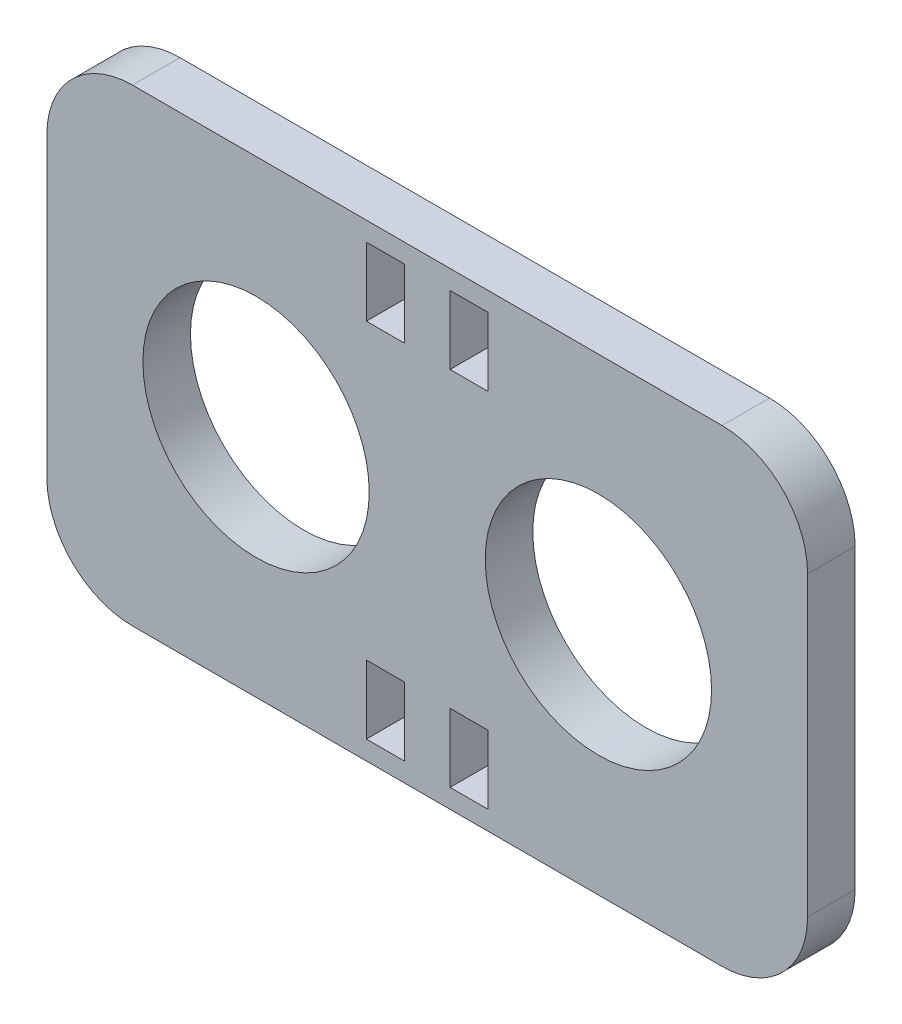
ISO-10303-21;
HEADER;
FILE_DESCRIPTION(('STEP AP214'),'2;1');
FILE_NAME('part.step','',(''),(''),'','','');
FILE_SCHEMA(('AUTOMOTIVE_DESIGN { 1 0 10303 214 1 1 1 1 }'));
ENDSEC;
DATA;
#1=APPLICATION_CONTEXT('core data for automotive mechanical design processes');
#2=APPLICATION_PROTOCOL_DEFINITION('international standard','automotive_design',2000,#1);
#3=PRODUCT_CONTEXT('',#1,'mechanical');
#4=PRODUCT('Part','Part','',(#3));
#5=PRODUCT_RELATED_PRODUCT_CATEGORY('part','',(#4));
#6=PRODUCT_DEFINITION_FORMATION('','',#4);
#7=PRODUCT_DEFINITION_CONTEXT('part definition',#1,'design');
#8=PRODUCT_DEFINITION('design','',#6,#7);
#9=PRODUCT_DEFINITION_SHAPE('','',#8);
#10=(LENGTH_UNIT() NAMED_UNIT(*) SI_UNIT(.MILLI.,.METRE.));
#11=(NAMED_UNIT(*) PLANE_ANGLE_UNIT() SI_UNIT($,.RADIAN.));
#12=(NAMED_UNIT(*) SI_UNIT($,.STERADIAN.) SOLID_ANGLE_UNIT());
#13=UNCERTAINTY_MEASURE_WITH_UNIT(LENGTH_MEASURE(1.E-05),#10,'distance_accuracy_value','');
#14=(GEOMETRIC_REPRESENTATION_CONTEXT(3) GLOBAL_UNCERTAINTY_ASSIGNED_CONTEXT((#13)) GLOBAL_UNIT_ASSIGNED_CONTEXT((#10,
#11,#12)) REPRESENTATION_CONTEXT('',''));
#15=CARTESIAN_POINT('',(0.,0.,0.));
#16=DIRECTION('',(0.,0.,1.));
#17=DIRECTION('',(1.,0.,0.));
#18=AXIS2_PLACEMENT_3D('',#15,#16,#17);
#19=CARTESIAN_POINT('',(-8.25500000000001,9.92499231180402,3.175));
#20=DIRECTION('',(0.,0.,1.));
#21=DIRECTION('',(1.,0.,0.));
#22=AXIS2_PLACEMENT_3D('',#19,#20,#21);
#23=PLANE('',#22);
#24=CARTESIAN_POINT('',(0.,0.,3.175));
#25=DIRECTION('',(0.,0.,1.));
#26=DIRECTION('',(1.,0.,0.));
#27=AXIS2_PLACEMENT_3D('',#24,#25,#26);
#28=CIRCLE('',#27,7.5565);
#29=CARTESIAN_POINT('',(7.5565,0.,3.175));
#30=VERTEX_POINT('',#29);
#31=EDGE_CURVE('E424',#30,#30,#28,.T.);
#32=ORIENTED_EDGE('',*,*,#31,.F.);
#33=EDGE_LOOP('',(#32));
#34=FACE_BOUND('',#33,.T.);
#35=DIRECTION('',(0.,1.,0.));
#36=VECTOR('',#35,1.);
#37=CARTESIAN_POINT('',(12.954,-14.369992311804,3.175));
#38=LINE('',#37,#36);
#39=CARTESIAN_POINT('',(12.954,-14.369992311804,3.175));
#40=VERTEX_POINT('',#39);
#41=CARTESIAN_POINT('',(12.954,-9.79799231180403,3.175));
#42=VERTEX_POINT('',#41);
#43=EDGE_CURVE('E435',#40,#42,#38,.T.);
#44=ORIENTED_EDGE('',*,*,#43,.T.);
#45=DIRECTION('',(1.,0.,0.));
#46=VECTOR('',#45,1.);
#47=CARTESIAN_POINT('',(12.954,-9.79799231180403,3.175));
#48=LINE('',#47,#46);
#49=CARTESIAN_POINT('',(15.494,-9.79799231180403,3.175));
#50=VERTEX_POINT('',#49);
#51=EDGE_CURVE('E438',#42,#50,#48,.T.);
#52=ORIENTED_EDGE('',*,*,#51,.T.);
#53=DIRECTION('',(0.,1.,0.));
#54=VECTOR('',#53,1.);
#55=CARTESIAN_POINT('',(15.494,-14.369992311804,3.175));
#56=LINE('',#55,#54);
#57=CARTESIAN_POINT('',(15.494,-14.369992311804,3.175));
#58=VERTEX_POINT('',#57);
#59=EDGE_CURVE('E442',#58,#50,#56,.T.);
#60=ORIENTED_EDGE('',*,*,#59,.F.);
#61=DIRECTION('',(1.,0.,0.));
#62=VECTOR('',#61,1.);
#63=CARTESIAN_POINT('',(12.954,-14.369992311804,3.175));
#64=LINE('',#63,#62);
#65=EDGE_CURVE('E445',#40,#58,#64,.T.);
#66=ORIENTED_EDGE('',*,*,#65,.F.);
#67=EDGE_LOOP('',(#44,#52,#60,#66));
#68=FACE_BOUND('',#67,.T.);
#69=CARTESIAN_POINT('',(-8.25500000000001,9.92499231180402,3.175));
#70=DIRECTION('',(0.,0.,1.));
#71=DIRECTION('',(1.,0.,0.));
#72=AXIS2_PLACEMENT_3D('',#69,#70,#71);
#73=CIRCLE('',#72,5.715);
#74=CARTESIAN_POINT('',(-8.25499999999997,15.639992311804,3.175));
#75=VERTEX_POINT('',#74);
#76=CARTESIAN_POINT('',(-13.97,9.92499231180402,3.175));
#77=VERTEX_POINT('',#76);
#78=EDGE_CURVE('E530',#75,#77,#73,.T.);
#79=ORIENTED_EDGE('',*,*,#78,.T.);
#80=DIRECTION('',(0.,-1.,0.));
#81=VECTOR('',#80,1.);
#82=CARTESIAN_POINT('',(-13.97,9.92499231180402,3.175));
#83=LINE('',#82,#81);
#84=CARTESIAN_POINT('',(-13.97,-9.92499231180395,3.175));
#85=VERTEX_POINT('',#84);
#86=EDGE_CURVE('E533',#77,#85,#83,.T.);
#87=ORIENTED_EDGE('',*,*,#86,.T.);
#88=CARTESIAN_POINT('',(-8.255,-9.92499231180403,3.175));
#89=DIRECTION('',(0.,0.,1.));
#90=DIRECTION('',(1.,0.,0.));
#91=AXIS2_PLACEMENT_3D('',#88,#89,#90);
#92=CIRCLE('',#91,5.715);
#93=CARTESIAN_POINT('',(-8.25499999999997,-15.639992311804,3.175));
#94=VERTEX_POINT('',#93);
#95=EDGE_CURVE('E536',#85,#94,#92,.T.);
#96=ORIENTED_EDGE('',*,*,#95,.T.);
#97=DIRECTION('',(1.,0.,0.));
#98=VECTOR('',#97,1.);
#99=CARTESIAN_POINT('',(-8.25499999999997,-15.639992311804,3.175));
#100=LINE('',#99,#98);
#101=CARTESIAN_POINT('',(31.115,-15.639992311804,3.175));
#102=VERTEX_POINT('',#101);
#103=EDGE_CURVE('E538',#94,#102,#100,.T.);
#104=ORIENTED_EDGE('',*,*,#103,.T.);
#105=CARTESIAN_POINT('',(31.115,-9.92499231180402,3.175));
#106=DIRECTION('',(0.,0.,-1.));
#107=DIRECTION('',(-1.,0.,0.));
#108=AXIS2_PLACEMENT_3D('',#105,#106,#107);
#109=CIRCLE('',#108,5.715);
#110=CARTESIAN_POINT('',(36.83,-9.92499231180402,3.175));
#111=VERTEX_POINT('',#110);
#112=EDGE_CURVE('E540',#111,#102,#109,.T.);
#113=ORIENTED_EDGE('',*,*,#112,.F.);
#114=DIRECTION('',(0.,-1.,0.));
#115=VECTOR('',#114,1.);
#116=CARTESIAN_POINT('',(36.83,9.92499231180402,3.175));
#117=LINE('',#116,#115);
#118=CARTESIAN_POINT('',(36.83,9.92499231180402,3.175));
#119=VERTEX_POINT('',#118);
#120=EDGE_CURVE('E543',#119,#111,#117,.T.);
#121=ORIENTED_EDGE('',*,*,#120,.F.);
#122=CARTESIAN_POINT('',(31.115,9.92499231180402,3.175));
#123=DIRECTION('',(0.,0.,1.));
#124=DIRECTION('',(1.,0.,0.));
#125=AXIS2_PLACEMENT_3D('',#122,#123,#124);
#126=CIRCLE('',#125,5.715);
#127=CARTESIAN_POINT('',(31.115,15.639992311804,3.175));
#128=VERTEX_POINT('',#127);
#129=EDGE_CURVE('E546',#119,#128,#126,.T.);
#130=ORIENTED_EDGE('',*,*,#129,.T.);
#131=DIRECTION('',(1.,0.,0.));
#132=VECTOR('',#131,1.);
#133=CARTESIAN_POINT('',(-8.25499999999997,15.639992311804,3.175));
#134=LINE('',#133,#132);
#135=EDGE_CURVE('E548',#75,#128,#134,.T.);
#136=ORIENTED_EDGE('',*,*,#135,.F.);
#137=EDGE_LOOP('',(#79,#87,#96,#104,#113,#121,#130,#136));
#138=FACE_BOUND('',#137,.T.);
#139=DIRECTION('',(0.,-1.,0.));
#140=VECTOR('',#139,1.);
#141=CARTESIAN_POINT('',(7.36599999999999,14.369992311804,3.175));
#142=LINE('',#141,#140);
#143=CARTESIAN_POINT('',(7.36599999999999,14.369992311804,3.175));
#144=VERTEX_POINT('',#143);
#145=CARTESIAN_POINT('',(7.36599999999999,9.79799231180402,3.175));
#146=VERTEX_POINT('',#145);
#147=EDGE_CURVE('E500',#144,#146,#142,.T.);
#148=ORIENTED_EDGE('',*,*,#147,.F.);
#149=DIRECTION('',(-1.,0.,0.));
#150=VECTOR('',#149,1.);
#151=CARTESIAN_POINT('',(9.90599999999999,14.369992311804,3.175));
#152=LINE('',#151,#150);
#153=CARTESIAN_POINT('',(9.90599999999999,14.369992311804,3.175));
#154=VERTEX_POINT('',#153);
#155=EDGE_CURVE('E498',#154,#144,#152,.T.);
#156=ORIENTED_EDGE('',*,*,#155,.F.);
#157=DIRECTION('',(0.,-1.,0.));
#158=VECTOR('',#157,1.);
#159=CARTESIAN_POINT('',(9.90599999999999,14.369992311804,3.175));
#160=LINE('',#159,#158);
#161=CARTESIAN_POINT('',(9.90599999999999,9.79799231180402,3.175));
#162=VERTEX_POINT('',#161);
#163=EDGE_CURVE('E506',#154,#162,#160,.T.);
#164=ORIENTED_EDGE('',*,*,#163,.T.);
#165=DIRECTION('',(-1.,0.,0.));
#166=VECTOR('',#165,1.);
#167=CARTESIAN_POINT('',(9.90599999999999,9.79799231180402,3.175));
#168=LINE('',#167,#166);
#169=EDGE_CURVE('E503',#162,#146,#168,.T.);
#170=ORIENTED_EDGE('',*,*,#169,.T.);
#171=EDGE_LOOP('',(#148,#156,#164,#170));
#172=FACE_BOUND('',#171,.T.);
#173=DIRECTION('',(1.,0.,0.));
#174=VECTOR('',#173,1.);
#175=CARTESIAN_POINT('',(12.954,9.79799231180402,3.175));
#176=LINE('',#175,#174);
#177=CARTESIAN_POINT('',(12.954,9.79799231180402,3.175));
#178=VERTEX_POINT('',#177);
#179=CARTESIAN_POINT('',(15.494,9.79799231180402,3.175));
#180=VERTEX_POINT('',#179);
#181=EDGE_CURVE('E468',#178,#180,#176,.T.);
#182=ORIENTED_EDGE('',*,*,#181,.F.);
#183=DIRECTION('',(0.,-1.,0.));
#184=VECTOR('',#183,1.);
#185=CARTESIAN_POINT('',(12.954,14.369992311804,3.175));
#186=LINE('',#185,#184);
#187=CARTESIAN_POINT('',(12.954,14.369992311804,3.175));
#188=VERTEX_POINT('',#187);
#189=EDGE_CURVE('E466',#188,#178,#186,.T.);
#190=ORIENTED_EDGE('',*,*,#189,.F.);
#191=DIRECTION('',(1.,0.,0.));
#192=VECTOR('',#191,1.);
#193=CARTESIAN_POINT('',(12.954,14.369992311804,3.175));
#194=LINE('',#193,#192);
#195=CARTESIAN_POINT('',(15.494,14.369992311804,3.175));
#196=VERTEX_POINT('',#195);
#197=EDGE_CURVE('E474',#188,#196,#194,.T.);
#198=ORIENTED_EDGE('',*,*,#197,.T.);
#199=DIRECTION('',(0.,-1.,0.));
#200=VECTOR('',#199,1.);
#201=CARTESIAN_POINT('',(15.494,14.369992311804,3.175));
#202=LINE('',#201,#200);
#203=EDGE_CURVE('E471',#196,#180,#202,.T.);
#204=ORIENTED_EDGE('',*,*,#203,.T.);
#205=EDGE_LOOP('',(#182,#190,#198,#204));
#206=FACE_BOUND('',#205,.T.);
#207=DIRECTION('',(-1.,0.,0.));
#208=VECTOR('',#207,1.);
#209=CARTESIAN_POINT('',(9.90599999999998,-9.79799231180403,3.175));
#210=LINE('',#209,#208);
#211=CARTESIAN_POINT('',(9.90599999999998,-9.79799231180403,3.175));
#212=VERTEX_POINT('',#211);
#213=CARTESIAN_POINT('',(7.36599999999999,-9.79799231180403,3.175));
#214=VERTEX_POINT('',#213);
#215=EDGE_CURVE('E406',#212,#214,#210,.T.);
#216=ORIENTED_EDGE('',*,*,#215,.F.);
#217=DIRECTION('',(0.,1.,0.));
#218=VECTOR('',#217,1.);
#219=CARTESIAN_POINT('',(9.90599999999998,-14.369992311804,3.175));
#220=LINE('',#219,#218);
#221=CARTESIAN_POINT('',(9.90599999999998,-14.369992311804,3.175));
#222=VERTEX_POINT('',#221);
#223=EDGE_CURVE('E397',#222,#212,#220,.T.);
#224=ORIENTED_EDGE('',*,*,#223,.F.);
#225=DIRECTION('',(-1.,0.,0.));
#226=VECTOR('',#225,1.);
#227=CARTESIAN_POINT('',(9.90599999999998,-14.369992311804,3.175));
#228=LINE('',#227,#226);
#229=CARTESIAN_POINT('',(7.36599999999999,-14.369992311804,3.175));
#230=VERTEX_POINT('',#229);
#231=EDGE_CURVE('E418',#222,#230,#228,.T.);
#232=ORIENTED_EDGE('',*,*,#231,.T.);
#233=DIRECTION('',(0.,1.,0.));
#234=VECTOR('',#233,1.);
#235=CARTESIAN_POINT('',(7.36599999999999,-14.369992311804,3.175));
#236=LINE('',#235,#234);
#237=EDGE_CURVE('E251',#230,#214,#236,.T.);
#238=ORIENTED_EDGE('',*,*,#237,.T.);
#239=EDGE_LOOP('',(#216,#224,#232,#238));
#240=FACE_BOUND('',#239,.T.);
#241=CARTESIAN_POINT('',(22.86,0.,3.175));
#242=DIRECTION('',(0.,0.,1.));
#243=DIRECTION('',(1.,0.,0.));
#244=AXIS2_PLACEMENT_3D('',#241,#242,#243);
#245=CIRCLE('',#244,7.5565);
#246=CARTESIAN_POINT('',(30.4165,0.,3.175));
#247=VERTEX_POINT('',#246);
#248=EDGE_CURVE('E883',#247,#247,#245,.T.);
#249=ORIENTED_EDGE('',*,*,#248,.F.);
#250=EDGE_LOOP('',(#249));
#251=FACE_BOUND('',#250,.T.);
#252=ADVANCED_FACE('F236',(#34,#68,#138,#172,#206,#240,#251),#23,.T.);
#253=CARTESIAN_POINT('',(-8.25500000000001,9.92499231180402,0.));
#254=DIRECTION('',(0.,0.,1.));
#255=DIRECTION('',(1.,0.,0.));
#256=AXIS2_PLACEMENT_3D('',#253,#254,#255);
#257=PLANE('',#256);
#258=DIRECTION('',(0.,-1.,0.));
#259=VECTOR('',#258,1.);
#260=CARTESIAN_POINT('',(12.954,14.369992311804,0.));
#261=LINE('',#260,#259);
#262=CARTESIAN_POINT('',(12.954,14.369992311804,0.));
#263=VERTEX_POINT('',#262);
#264=CARTESIAN_POINT('',(12.954,9.79799231180402,0.));
#265=VERTEX_POINT('',#264);
#266=EDGE_CURVE('E459',#263,#265,#261,.T.);
#267=ORIENTED_EDGE('',*,*,#266,.T.);
#268=DIRECTION('',(1.,0.,0.));
#269=VECTOR('',#268,1.);
#270=CARTESIAN_POINT('',(12.954,9.79799231180402,0.));
#271=LINE('',#270,#269);
#272=CARTESIAN_POINT('',(15.494,9.79799231180402,0.));
#273=VERTEX_POINT('',#272);
#274=EDGE_CURVE('E480',#265,#273,#271,.T.);
#275=ORIENTED_EDGE('',*,*,#274,.T.);
#276=DIRECTION('',(0.,-1.,0.));
#277=VECTOR('',#276,1.);
#278=CARTESIAN_POINT('',(15.494,14.369992311804,0.));
#279=LINE('',#278,#277);
#280=CARTESIAN_POINT('',(15.494,14.369992311804,0.));
#281=VERTEX_POINT('',#280);
#282=EDGE_CURVE('E483',#281,#273,#279,.T.);
#283=ORIENTED_EDGE('',*,*,#282,.F.);
#284=DIRECTION('',(1.,0.,0.));
#285=VECTOR('',#284,1.);
#286=CARTESIAN_POINT('',(12.954,14.369992311804,0.));
#287=LINE('',#286,#285);
#288=EDGE_CURVE('E469',#263,#281,#287,.T.);
#289=ORIENTED_EDGE('',*,*,#288,.F.);
#290=EDGE_LOOP('',(#267,#275,#283,#289));
#291=FACE_BOUND('',#290,.T.);
#292=CARTESIAN_POINT('',(-8.25500000000001,9.92499231180402,0.));
#293=DIRECTION('',(0.,0.,1.));
#294=DIRECTION('',(1.,0.,0.));
#295=AXIS2_PLACEMENT_3D('',#292,#293,#294);
#296=CIRCLE('',#295,5.715);
#297=CARTESIAN_POINT('',(-8.25499999999997,15.639992311804,0.));
#298=VERTEX_POINT('',#297);
#299=CARTESIAN_POINT('',(-13.97,9.92499231180402,0.));
#300=VERTEX_POINT('',#299);
#301=EDGE_CURVE('E529',#298,#300,#296,.T.);
#302=ORIENTED_EDGE('',*,*,#301,.F.);
#303=DIRECTION('',(1.,0.,0.));
#304=VECTOR('',#303,1.);
#305=CARTESIAN_POINT('',(-8.25499999999997,15.639992311804,0.));
#306=LINE('',#305,#304);
#307=CARTESIAN_POINT('',(31.115,15.639992311804,0.));
#308=VERTEX_POINT('',#307);
#309=EDGE_CURVE('E534',#298,#308,#306,.T.);
#310=ORIENTED_EDGE('',*,*,#309,.T.);
#311=CARTESIAN_POINT('',(31.115,9.92499231180402,0.));
#312=DIRECTION('',(0.,0.,1.));
#313=DIRECTION('',(1.,0.,0.));
#314=AXIS2_PLACEMENT_3D('',#311,#312,#313);
#315=CIRCLE('',#314,5.715);
#316=CARTESIAN_POINT('',(36.83,9.92499231180402,0.));
#317=VERTEX_POINT('',#316);
#318=EDGE_CURVE('E567',#317,#308,#315,.T.);
#319=ORIENTED_EDGE('',*,*,#318,.F.);
#320=DIRECTION('',(0.,-1.,0.));
#321=VECTOR('',#320,1.);
#322=CARTESIAN_POINT('',(36.83,9.92499231180402,0.));
#323=LINE('',#322,#321);
#324=CARTESIAN_POINT('',(36.83,-9.92499231180402,0.));
#325=VERTEX_POINT('',#324);
#326=EDGE_CURVE('E564',#317,#325,#323,.T.);
#327=ORIENTED_EDGE('',*,*,#326,.T.);
#328=CARTESIAN_POINT('',(31.115,-9.92499231180402,0.));
#329=DIRECTION('',(0.,0.,-1.));
#330=DIRECTION('',(-1.,0.,0.));
#331=AXIS2_PLACEMENT_3D('',#328,#329,#330);
#332=CIRCLE('',#331,5.715);
#333=CARTESIAN_POINT('',(31.115,-15.639992311804,0.));
#334=VERTEX_POINT('',#333);
#335=EDGE_CURVE('E561',#325,#334,#332,.T.);
#336=ORIENTED_EDGE('',*,*,#335,.T.);
#337=DIRECTION('',(1.,0.,0.));
#338=VECTOR('',#337,1.);
#339=CARTESIAN_POINT('',(-8.25499999999997,-15.639992311804,0.));
#340=LINE('',#339,#338);
#341=CARTESIAN_POINT('',(-8.25499999999997,-15.639992311804,0.));
#342=VERTEX_POINT('',#341);
#343=EDGE_CURVE('E558',#342,#334,#340,.T.);
#344=ORIENTED_EDGE('',*,*,#343,.F.);
#345=CARTESIAN_POINT('',(-8.255,-9.92499231180403,0.));
#346=DIRECTION('',(0.,0.,1.));
#347=DIRECTION('',(1.,0.,0.));
#348=AXIS2_PLACEMENT_3D('',#345,#346,#347);
#349=CIRCLE('',#348,5.715);
#350=CARTESIAN_POINT('',(-13.97,-9.92499231180395,0.));
#351=VERTEX_POINT('',#350);
#352=EDGE_CURVE('E556',#351,#342,#349,.T.);
#353=ORIENTED_EDGE('',*,*,#352,.F.);
#354=DIRECTION('',(0.,-1.,0.));
#355=VECTOR('',#354,1.);
#356=CARTESIAN_POINT('',(-13.97,9.92499231180402,0.));
#357=LINE('',#356,#355);
#358=EDGE_CURVE('E554',#300,#351,#357,.T.);
#359=ORIENTED_EDGE('',*,*,#358,.F.);
#360=EDGE_LOOP('',(#302,#310,#319,#327,#336,#344,#353,#359));
#361=FACE_BOUND('',#360,.T.);
#362=DIRECTION('',(-1.,0.,0.));
#363=VECTOR('',#362,1.);
#364=CARTESIAN_POINT('',(9.90599999999999,14.369992311804,0.));
#365=LINE('',#364,#363);
#366=CARTESIAN_POINT('',(9.90599999999999,14.369992311804,0.));
#367=VERTEX_POINT('',#366);
#368=CARTESIAN_POINT('',(7.36599999999999,14.369992311804,0.));
#369=VERTEX_POINT('',#368);
#370=EDGE_CURVE('E497',#367,#369,#365,.T.);
#371=ORIENTED_EDGE('',*,*,#370,.T.);
#372=DIRECTION('',(0.,-1.,0.));
#373=VECTOR('',#372,1.);
#374=CARTESIAN_POINT('',(7.36599999999999,14.369992311804,0.));
#375=LINE('',#374,#373);
#376=CARTESIAN_POINT('',(7.36599999999999,9.79799231180402,0.));
#377=VERTEX_POINT('',#376);
#378=EDGE_CURVE('E512',#369,#377,#375,.T.);
#379=ORIENTED_EDGE('',*,*,#378,.T.);
#380=DIRECTION('',(-1.,0.,0.));
#381=VECTOR('',#380,1.);
#382=CARTESIAN_POINT('',(9.90599999999999,9.79799231180402,0.));
#383=LINE('',#382,#381);
#384=CARTESIAN_POINT('',(9.90599999999999,9.79799231180402,0.));
#385=VERTEX_POINT('',#384);
#386=EDGE_CURVE('E515',#385,#377,#383,.T.);
#387=ORIENTED_EDGE('',*,*,#386,.F.);
#388=DIRECTION('',(0.,-1.,0.));
#389=VECTOR('',#388,1.);
#390=CARTESIAN_POINT('',(9.90599999999999,14.369992311804,0.));
#391=LINE('',#390,#389);
#392=EDGE_CURVE('E501',#367,#385,#391,.T.);
#393=ORIENTED_EDGE('',*,*,#392,.F.);
#394=EDGE_LOOP('',(#371,#379,#387,#393));
#395=FACE_BOUND('',#394,.T.);
#396=DIRECTION('',(1.,0.,0.));
#397=VECTOR('',#396,1.);
#398=CARTESIAN_POINT('',(12.954,-9.79799231180403,0.));
#399=LINE('',#398,#397);
#400=CARTESIAN_POINT('',(12.954,-9.79799231180403,0.));
#401=VERTEX_POINT('',#400);
#402=CARTESIAN_POINT('',(15.494,-9.79799231180403,0.));
#403=VERTEX_POINT('',#402);
#404=EDGE_CURVE('E449',#401,#403,#399,.T.);
#405=ORIENTED_EDGE('',*,*,#404,.F.);
#406=DIRECTION('',(0.,1.,0.));
#407=VECTOR('',#406,1.);
#408=CARTESIAN_POINT('',(12.954,-14.369992311804,0.));
#409=LINE('',#408,#407);
#410=CARTESIAN_POINT('',(12.954,-14.369992311804,0.));
#411=VERTEX_POINT('',#410);
#412=EDGE_CURVE('E413',#411,#401,#409,.T.);
#413=ORIENTED_EDGE('',*,*,#412,.F.);
#414=DIRECTION('',(1.,0.,0.));
#415=VECTOR('',#414,1.);
#416=CARTESIAN_POINT('',(12.954,-14.369992311804,0.));
#417=LINE('',#416,#415);
#418=CARTESIAN_POINT('',(15.494,-14.369992311804,0.));
#419=VERTEX_POINT('',#418);
#420=EDGE_CURVE('E439',#411,#419,#417,.T.);
#421=ORIENTED_EDGE('',*,*,#420,.T.);
#422=DIRECTION('',(0.,1.,0.));
#423=VECTOR('',#422,1.);
#424=CARTESIAN_POINT('',(15.494,-14.369992311804,0.));
#425=LINE('',#424,#423);
#426=EDGE_CURVE('E452',#419,#403,#425,.T.);
#427=ORIENTED_EDGE('',*,*,#426,.T.);
#428=EDGE_LOOP('',(#405,#413,#421,#427));
#429=FACE_BOUND('',#428,.T.);
#430=DIRECTION('',(0.,1.,0.));
#431=VECTOR('',#430,1.);
#432=CARTESIAN_POINT('',(9.90599999999998,-14.369992311804,0.));
#433=LINE('',#432,#431);
#434=CARTESIAN_POINT('',(9.90599999999998,-14.369992311804,0.));
#435=VERTEX_POINT('',#434);
#436=CARTESIAN_POINT('',(9.90599999999998,-9.79799231180403,0.));
#437=VERTEX_POINT('',#436);
#438=EDGE_CURVE('E259',#435,#437,#433,.T.);
#439=ORIENTED_EDGE('',*,*,#438,.T.);
#440=DIRECTION('',(-1.,0.,0.));
#441=VECTOR('',#440,1.);
#442=CARTESIAN_POINT('',(9.90599999999998,-9.79799231180403,0.));
#443=LINE('',#442,#441);
#444=CARTESIAN_POINT('',(7.36599999999999,-9.79799231180403,0.));
#445=VERTEX_POINT('',#444);
#446=EDGE_CURVE('E412',#437,#445,#443,.T.);
#447=ORIENTED_EDGE('',*,*,#446,.T.);
#448=DIRECTION('',(0.,1.,0.));
#449=VECTOR('',#448,1.);
#450=CARTESIAN_POINT('',(7.36599999999999,-14.369992311804,0.));
#451=LINE('',#450,#449);
#452=CARTESIAN_POINT('',(7.36599999999999,-14.369992311804,0.));
#453=VERTEX_POINT('',#452);
#454=EDGE_CURVE('E426',#453,#445,#451,.T.);
#455=ORIENTED_EDGE('',*,*,#454,.F.);
#456=DIRECTION('',(-1.,0.,0.));
#457=VECTOR('',#456,1.);
#458=CARTESIAN_POINT('',(9.90599999999998,-14.369992311804,0.));
#459=LINE('',#458,#457);
#460=EDGE_CURVE('E407',#435,#453,#459,.T.);
#461=ORIENTED_EDGE('',*,*,#460,.F.);
#462=EDGE_LOOP('',(#439,#447,#455,#461));
#463=FACE_BOUND('',#462,.T.);
#464=CARTESIAN_POINT('',(0.,0.,0.));
#465=DIRECTION('',(0.,0.,1.));
#466=DIRECTION('',(1.,0.,0.));
#467=AXIS2_PLACEMENT_3D('',#464,#465,#466);
#468=CIRCLE('',#467,7.5565);
#469=CARTESIAN_POINT('',(7.5565,0.,0.));
#470=VERTEX_POINT('',#469);
#471=EDGE_CURVE('E889',#470,#470,#468,.T.);
#472=ORIENTED_EDGE('',*,*,#471,.T.);
#473=EDGE_LOOP('',(#472));
#474=FACE_BOUND('',#473,.T.);
#475=CARTESIAN_POINT('',(22.86,0.,0.));
#476=DIRECTION('',(0.,0.,1.));
#477=DIRECTION('',(1.,0.,0.));
#478=AXIS2_PLACEMENT_3D('',#475,#476,#477);
#479=CIRCLE('',#478,7.5565);
#480=CARTESIAN_POINT('',(30.4165,0.,0.));
#481=VERTEX_POINT('',#480);
#482=EDGE_CURVE('E886',#481,#481,#479,.T.);
#483=ORIENTED_EDGE('',*,*,#482,.T.);
#484=EDGE_LOOP('',(#483));
#485=FACE_BOUND('',#484,.T.);
#486=ADVANCED_FACE('F594',(#291,#361,#395,#429,#463,#474,#485),#257,.F.);
#487=CARTESIAN_POINT('',(-8.25500000000001,9.92499231180402,3.175));
#488=DIRECTION('',(0.,0.,-1.));
#489=DIRECTION('',(-1.,0.,0.));
#490=AXIS2_PLACEMENT_3D('',#487,#488,#489);
#491=CYLINDRICAL_SURFACE('',#490,5.715);
#492=ORIENTED_EDGE('',*,*,#301,.T.);
#493=DIRECTION('',(0.,0.,-1.));
#494=VECTOR('',#493,1.);
#495=CARTESIAN_POINT('',(-13.97,9.92499231180402,3.175));
#496=LINE('',#495,#494);
#497=EDGE_CURVE('E12',#77,#300,#496,.T.);
#498=ORIENTED_EDGE('',*,*,#497,.F.);
#499=ORIENTED_EDGE('',*,*,#78,.F.);
#500=DIRECTION('',(0.,0.,-1.));
#501=VECTOR('',#500,1.);
#502=CARTESIAN_POINT('',(-8.25499999999997,15.639992311804,3.175));
#503=LINE('',#502,#501);
#504=EDGE_CURVE('E551',#75,#298,#503,.T.);
#505=ORIENTED_EDGE('',*,*,#504,.T.);
#506=EDGE_LOOP('',(#492,#498,#499,#505));
#507=FACE_BOUND('',#506,.T.);
#508=ADVANCED_FACE('F238',(#507),#491,.T.);
#509=CARTESIAN_POINT('',(-13.97,9.92499231180402,3.175));
#510=DIRECTION('',(1.,0.,0.));
#511=DIRECTION('',(0.,1.,0.));
#512=AXIS2_PLACEMENT_3D('',#509,#510,#511);
#513=PLANE('',#512);
#514=ORIENTED_EDGE('',*,*,#358,.T.);
#515=DIRECTION('',(0.,0.,-1.));
#516=VECTOR('',#515,1.);
#517=CARTESIAN_POINT('',(-13.97,-9.92499231180395,3.175));
#518=LINE('',#517,#516);
#519=EDGE_CURVE('E244',#85,#351,#518,.T.);
#520=ORIENTED_EDGE('',*,*,#519,.F.);
#521=ORIENTED_EDGE('',*,*,#86,.F.);
#522=ORIENTED_EDGE('',*,*,#497,.T.);
#523=EDGE_LOOP('',(#514,#520,#521,#522));
#524=FACE_BOUND('',#523,.T.);
#525=ADVANCED_FACE('F608',(#524),#513,.F.);
#526=CARTESIAN_POINT('',(-8.255,-9.92499231180403,3.175));
#527=DIRECTION('',(0.,0.,-1.));
#528=DIRECTION('',(-1.,0.,0.));
#529=AXIS2_PLACEMENT_3D('',#526,#527,#528);
#530=CYLINDRICAL_SURFACE('',#529,5.715);
#531=ORIENTED_EDGE('',*,*,#352,.T.);
#532=DIRECTION('',(0.,0.,-1.));
#533=VECTOR('',#532,1.);
#534=CARTESIAN_POINT('',(-8.25499999999997,-15.639992311804,3.175));
#535=LINE('',#534,#533);
#536=EDGE_CURVE('E581',#94,#342,#535,.T.);
#537=ORIENTED_EDGE('',*,*,#536,.F.);
#538=ORIENTED_EDGE('',*,*,#95,.F.);
#539=ORIENTED_EDGE('',*,*,#519,.T.);
#540=EDGE_LOOP('',(#531,#537,#538,#539));
#541=FACE_BOUND('',#540,.T.);
#542=ADVANCED_FACE('F588',(#541),#530,.T.);
#543=CARTESIAN_POINT('',(-8.25499999999997,-15.639992311804,3.175));
#544=DIRECTION('',(0.,1.,0.));
#545=DIRECTION('',(-1.,0.,0.));
#546=AXIS2_PLACEMENT_3D('',#543,#544,#545);
#547=PLANE('',#546);
#548=ORIENTED_EDGE('',*,*,#343,.T.);
#549=DIRECTION('',(0.,0.,-1.));
#550=VECTOR('',#549,1.);
#551=CARTESIAN_POINT('',(31.115,-15.639992311804,3.175));
#552=LINE('',#551,#550);
#553=EDGE_CURVE('E579',#102,#334,#552,.T.);
#554=ORIENTED_EDGE('',*,*,#553,.F.);
#555=ORIENTED_EDGE('',*,*,#103,.F.);
#556=ORIENTED_EDGE('',*,*,#536,.T.);
#557=EDGE_LOOP('',(#548,#554,#555,#556));
#558=FACE_BOUND('',#557,.T.);
#559=ADVANCED_FACE('F599',(#558),#547,.F.);
#560=CARTESIAN_POINT('',(31.115,-9.92499231180402,3.175));
#561=DIRECTION('',(0.,0.,-1.));
#562=DIRECTION('',(-1.,0.,0.));
#563=AXIS2_PLACEMENT_3D('',#560,#561,#562);
#564=CYLINDRICAL_SURFACE('',#563,5.715);
#565=ORIENTED_EDGE('',*,*,#335,.F.);
#566=DIRECTION('',(0.,0.,-1.));
#567=VECTOR('',#566,1.);
#568=CARTESIAN_POINT('',(36.83,-9.92499231180402,3.175));
#569=LINE('',#568,#567);
#570=EDGE_CURVE('E577',#111,#325,#569,.T.);
#571=ORIENTED_EDGE('',*,*,#570,.F.);
#572=ORIENTED_EDGE('',*,*,#112,.T.);
#573=ORIENTED_EDGE('',*,*,#553,.T.);
#574=EDGE_LOOP('',(#565,#571,#572,#573));
#575=FACE_BOUND('',#574,.T.);
#576=ADVANCED_FACE('F622',(#575),#564,.T.);
#577=CARTESIAN_POINT('',(36.83,9.92499231180402,3.175));
#578=DIRECTION('',(1.,0.,0.));
#579=DIRECTION('',(0.,0.,-1.));
#580=AXIS2_PLACEMENT_3D('',#577,#578,#579);
#581=PLANE('',#580);
#582=ORIENTED_EDGE('',*,*,#326,.F.);
#583=DIRECTION('',(0.,0.,-1.));
#584=VECTOR('',#583,1.);
#585=CARTESIAN_POINT('',(36.83,9.92499231180402,3.175));
#586=LINE('',#585,#584);
#587=EDGE_CURVE('E575',#119,#317,#586,.T.);
#588=ORIENTED_EDGE('',*,*,#587,.F.);
#589=ORIENTED_EDGE('',*,*,#120,.T.);
#590=ORIENTED_EDGE('',*,*,#570,.T.);
#591=EDGE_LOOP('',(#582,#588,#589,#590));
#592=FACE_BOUND('',#591,.T.);
#593=ADVANCED_FACE('F620',(#592),#581,.T.);
#594=CARTESIAN_POINT('',(31.115,9.92499231180402,3.175));
#595=DIRECTION('',(0.,0.,-1.));
#596=DIRECTION('',(-1.,0.,0.));
#597=AXIS2_PLACEMENT_3D('',#594,#595,#596);
#598=CYLINDRICAL_SURFACE('',#597,5.715);
#599=ORIENTED_EDGE('',*,*,#318,.T.);
#600=DIRECTION('',(0.,0.,-1.));
#601=VECTOR('',#600,1.);
#602=CARTESIAN_POINT('',(31.115,15.639992311804,3.175));
#603=LINE('',#602,#601);
#604=EDGE_CURVE('E573',#128,#308,#603,.T.);
#605=ORIENTED_EDGE('',*,*,#604,.F.);
#606=ORIENTED_EDGE('',*,*,#129,.F.);
#607=ORIENTED_EDGE('',*,*,#587,.T.);
#608=EDGE_LOOP('',(#599,#605,#606,#607));
#609=FACE_BOUND('',#608,.T.);
#610=ADVANCED_FACE('F617',(#609),#598,.T.);
#611=CARTESIAN_POINT('',(-8.25499999999997,15.639992311804,3.175));
#612=DIRECTION('',(0.,1.,0.));
#613=DIRECTION('',(0.,0.,1.));
#614=AXIS2_PLACEMENT_3D('',#611,#612,#613);
#615=PLANE('',#614);
#616=ORIENTED_EDGE('',*,*,#309,.F.);
#617=ORIENTED_EDGE('',*,*,#504,.F.);
#618=ORIENTED_EDGE('',*,*,#135,.T.);
#619=ORIENTED_EDGE('',*,*,#604,.T.);
#620=EDGE_LOOP('',(#616,#617,#618,#619));
#621=FACE_BOUND('',#620,.T.);
#622=ADVANCED_FACE('F613',(#621),#615,.T.);
#623=CARTESIAN_POINT('',(9.90599999999999,14.369992311804,3.175));
#624=DIRECTION('',(0.,-1.,0.));
#625=DIRECTION('',(0.,0.,-1.));
#626=AXIS2_PLACEMENT_3D('',#623,#624,#625);
#627=PLANE('',#626);
#628=ORIENTED_EDGE('',*,*,#370,.F.);
#629=DIRECTION('',(0.,0.,-1.));
#630=VECTOR('',#629,1.);
#631=CARTESIAN_POINT('',(9.90599999999999,14.369992311804,3.175));
#632=LINE('',#631,#630);
#633=EDGE_CURVE('E509',#154,#367,#632,.T.);
#634=ORIENTED_EDGE('',*,*,#633,.F.);
#635=ORIENTED_EDGE('',*,*,#155,.T.);
#636=DIRECTION('',(0.,0.,-1.));
#637=VECTOR('',#636,1.);
#638=CARTESIAN_POINT('',(7.36599999999999,14.369992311804,3.175));
#639=LINE('',#638,#637);
#640=EDGE_CURVE('E526',#144,#369,#639,.T.);
#641=ORIENTED_EDGE('',*,*,#640,.T.);
#642=EDGE_LOOP('',(#628,#634,#635,#641));
#643=FACE_BOUND('',#642,.T.);
#644=ADVANCED_FACE('F642',(#643),#627,.T.);
#645=CARTESIAN_POINT('',(7.36599999999999,14.369992311804,3.175));
#646=DIRECTION('',(1.,0.,0.));
#647=DIRECTION('',(0.,1.,0.));
#648=AXIS2_PLACEMENT_3D('',#645,#646,#647);
#649=PLANE('',#648);
#650=ORIENTED_EDGE('',*,*,#378,.F.);
#651=ORIENTED_EDGE('',*,*,#640,.F.);
#652=ORIENTED_EDGE('',*,*,#147,.T.);
#653=DIRECTION('',(0.,0.,-1.));
#654=VECTOR('',#653,1.);
#655=CARTESIAN_POINT('',(7.36599999999999,9.79799231180402,3.175));
#656=LINE('',#655,#654);
#657=EDGE_CURVE('E524',#146,#377,#656,.T.);
#658=ORIENTED_EDGE('',*,*,#657,.T.);
#659=EDGE_LOOP('',(#650,#651,#652,#658));
#660=FACE_BOUND('',#659,.T.);
#661=ADVANCED_FACE('F662',(#660),#649,.T.);
#662=CARTESIAN_POINT('',(9.90599999999999,9.79799231180402,3.175));
#663=DIRECTION('',(0.,-1.,0.));
#664=DIRECTION('',(1.,0.,0.));
#665=AXIS2_PLACEMENT_3D('',#662,#663,#664);
#666=PLANE('',#665);
#667=ORIENTED_EDGE('',*,*,#386,.T.);
#668=ORIENTED_EDGE('',*,*,#657,.F.);
#669=ORIENTED_EDGE('',*,*,#169,.F.);
#670=DIRECTION('',(0.,0.,-1.));
#671=VECTOR('',#670,1.);
#672=CARTESIAN_POINT('',(9.90599999999999,9.79799231180402,3.175));
#673=LINE('',#672,#671);
#674=EDGE_CURVE('E522',#162,#385,#673,.T.);
#675=ORIENTED_EDGE('',*,*,#674,.T.);
#676=EDGE_LOOP('',(#667,#668,#669,#675));
#677=FACE_BOUND('',#676,.T.);
#678=ADVANCED_FACE('F669',(#677),#666,.F.);
#679=CARTESIAN_POINT('',(9.90599999999999,14.369992311804,3.175));
#680=DIRECTION('',(1.,0.,0.));
#681=DIRECTION('',(0.,1.,0.));
#682=AXIS2_PLACEMENT_3D('',#679,#680,#681);
#683=PLANE('',#682);
#684=ORIENTED_EDGE('',*,*,#392,.T.);
#685=ORIENTED_EDGE('',*,*,#674,.F.);
#686=ORIENTED_EDGE('',*,*,#163,.F.);
#687=ORIENTED_EDGE('',*,*,#633,.T.);
#688=EDGE_LOOP('',(#684,#685,#686,#687));
#689=FACE_BOUND('',#688,.T.);
#690=ADVANCED_FACE('F676',(#689),#683,.F.);
#691=CARTESIAN_POINT('',(12.954,14.369992311804,3.175));
#692=DIRECTION('',(1.,0.,0.));
#693=DIRECTION('',(0.,0.,-1.));
#694=AXIS2_PLACEMENT_3D('',#691,#692,#693);
#695=PLANE('',#694);
#696=ORIENTED_EDGE('',*,*,#266,.F.);
#697=DIRECTION('',(0.,0.,-1.));
#698=VECTOR('',#697,1.);
#699=CARTESIAN_POINT('',(12.954,14.369992311804,3.175));
#700=LINE('',#699,#698);
#701=EDGE_CURVE('E477',#188,#263,#700,.T.);
#702=ORIENTED_EDGE('',*,*,#701,.F.);
#703=ORIENTED_EDGE('',*,*,#189,.T.);
#704=DIRECTION('',(0.,0.,-1.));
#705=VECTOR('',#704,1.);
#706=CARTESIAN_POINT('',(12.954,9.79799231180402,3.175));
#707=LINE('',#706,#705);
#708=EDGE_CURVE('E494',#178,#265,#707,.T.);
#709=ORIENTED_EDGE('',*,*,#708,.T.);
#710=EDGE_LOOP('',(#696,#702,#703,#709));
#711=FACE_BOUND('',#710,.T.);
#712=ADVANCED_FACE('F684',(#711),#695,.T.);
#713=CARTESIAN_POINT('',(12.954,9.79799231180402,3.175));
#714=DIRECTION('',(0.,1.,0.));
#715=DIRECTION('',(0.,0.,1.));
#716=AXIS2_PLACEMENT_3D('',#713,#714,#715);
#717=PLANE('',#716);
#718=ORIENTED_EDGE('',*,*,#274,.F.);
#719=ORIENTED_EDGE('',*,*,#708,.F.);
#720=ORIENTED_EDGE('',*,*,#181,.T.);
#721=DIRECTION('',(0.,0.,-1.));
#722=VECTOR('',#721,1.);
#723=CARTESIAN_POINT('',(15.494,9.79799231180402,3.175));
#724=LINE('',#723,#722);
#725=EDGE_CURVE('E492',#180,#273,#724,.T.);
#726=ORIENTED_EDGE('',*,*,#725,.T.);
#727=EDGE_LOOP('',(#718,#719,#720,#726));
#728=FACE_BOUND('',#727,.T.);
#729=ADVANCED_FACE('F692',(#728),#717,.T.);
#730=CARTESIAN_POINT('',(15.494,14.369992311804,3.175));
#731=DIRECTION('',(1.,0.,0.));
#732=DIRECTION('',(0.,0.,-1.));
#733=AXIS2_PLACEMENT_3D('',#730,#731,#732);
#734=PLANE('',#733);
#735=ORIENTED_EDGE('',*,*,#282,.T.);
#736=ORIENTED_EDGE('',*,*,#725,.F.);
#737=ORIENTED_EDGE('',*,*,#203,.F.);
#738=DIRECTION('',(0.,0.,-1.));
#739=VECTOR('',#738,1.);
#740=CARTESIAN_POINT('',(15.494,14.369992311804,3.175));
#741=LINE('',#740,#739);
#742=EDGE_CURVE('E490',#196,#281,#741,.T.);
#743=ORIENTED_EDGE('',*,*,#742,.T.);
#744=EDGE_LOOP('',(#735,#736,#737,#743));
#745=FACE_BOUND('',#744,.T.);
#746=ADVANCED_FACE('F700',(#745),#734,.F.);
#747=CARTESIAN_POINT('',(12.954,14.369992311804,3.175));
#748=DIRECTION('',(0.,1.,0.));
#749=DIRECTION('',(0.,0.,1.));
#750=AXIS2_PLACEMENT_3D('',#747,#748,#749);
#751=PLANE('',#750);
#752=ORIENTED_EDGE('',*,*,#288,.T.);
#753=ORIENTED_EDGE('',*,*,#742,.F.);
#754=ORIENTED_EDGE('',*,*,#197,.F.);
#755=ORIENTED_EDGE('',*,*,#701,.T.);
#756=EDGE_LOOP('',(#752,#753,#754,#755));
#757=FACE_BOUND('',#756,.T.);
#758=ADVANCED_FACE('F708',(#757),#751,.F.);
#759=CARTESIAN_POINT('',(12.954,-14.369992311804,3.175));
#760=DIRECTION('',(-1.,0.,0.));
#761=DIRECTION('',(0.,0.,1.));
#762=AXIS2_PLACEMENT_3D('',#759,#760,#761);
#763=PLANE('',#762);
#764=ORIENTED_EDGE('',*,*,#412,.T.);
#765=DIRECTION('',(0.,0.,-1.));
#766=VECTOR('',#765,1.);
#767=CARTESIAN_POINT('',(12.954,-9.79799231180403,3.175));
#768=LINE('',#767,#766);
#769=EDGE_CURVE('E447',#42,#401,#768,.T.);
#770=ORIENTED_EDGE('',*,*,#769,.F.);
#771=ORIENTED_EDGE('',*,*,#43,.F.);
#772=DIRECTION('',(0.,0.,-1.));
#773=VECTOR('',#772,1.);
#774=CARTESIAN_POINT('',(12.954,-14.369992311804,3.175));
#775=LINE('',#774,#773);
#776=EDGE_CURVE('E457',#40,#411,#775,.T.);
#777=ORIENTED_EDGE('',*,*,#776,.T.);
#778=EDGE_LOOP('',(#764,#770,#771,#777));
#779=FACE_BOUND('',#778,.T.);
#780=ADVANCED_FACE('F716',(#779),#763,.F.);
#781=CARTESIAN_POINT('',(12.954,-14.369992311804,3.175));
#782=DIRECTION('',(0.,1.,0.));
#783=DIRECTION('',(0.,0.,1.));
#784=AXIS2_PLACEMENT_3D('',#781,#782,#783);
#785=PLANE('',#784);
#786=ORIENTED_EDGE('',*,*,#420,.F.);
#787=ORIENTED_EDGE('',*,*,#776,.F.);
#788=ORIENTED_EDGE('',*,*,#65,.T.);
#789=DIRECTION('',(0.,0.,-1.));
#790=VECTOR('',#789,1.);
#791=CARTESIAN_POINT('',(15.494,-14.369992311804,3.175));
#792=LINE('',#791,#790);
#793=EDGE_CURVE('E460',#58,#419,#792,.T.);
#794=ORIENTED_EDGE('',*,*,#793,.T.);
#795=EDGE_LOOP('',(#786,#787,#788,#794));
#796=FACE_BOUND('',#795,.T.);
#797=ADVANCED_FACE('F724',(#796),#785,.T.);
#798=CARTESIAN_POINT('',(15.494,-14.369992311804,3.175));
#799=DIRECTION('',(-1.,0.,0.));
#800=DIRECTION('',(0.,0.,1.));
#801=AXIS2_PLACEMENT_3D('',#798,#799,#800);
#802=PLANE('',#801);
#803=ORIENTED_EDGE('',*,*,#426,.F.);
#804=ORIENTED_EDGE('',*,*,#793,.F.);
#805=ORIENTED_EDGE('',*,*,#59,.T.);
#806=DIRECTION('',(0.,0.,-1.));
#807=VECTOR('',#806,1.);
#808=CARTESIAN_POINT('',(15.494,-9.79799231180403,3.175));
#809=LINE('',#808,#807);
#810=EDGE_CURVE('E462',#50,#403,#809,.T.);
#811=ORIENTED_EDGE('',*,*,#810,.T.);
#812=EDGE_LOOP('',(#803,#804,#805,#811));
#813=FACE_BOUND('',#812,.T.);
#814=ADVANCED_FACE('F732',(#813),#802,.T.);
#815=CARTESIAN_POINT('',(12.954,-9.79799231180403,3.175));
#816=DIRECTION('',(0.,1.,0.));
#817=DIRECTION('',(0.,0.,1.));
#818=AXIS2_PLACEMENT_3D('',#815,#816,#817);
#819=PLANE('',#818);
#820=ORIENTED_EDGE('',*,*,#404,.T.);
#821=ORIENTED_EDGE('',*,*,#810,.F.);
#822=ORIENTED_EDGE('',*,*,#51,.F.);
#823=ORIENTED_EDGE('',*,*,#769,.T.);
#824=EDGE_LOOP('',(#820,#821,#822,#823));
#825=FACE_BOUND('',#824,.T.);
#826=ADVANCED_FACE('F740',(#825),#819,.F.);
#827=CARTESIAN_POINT('',(9.90599999999998,-14.369992311804,3.175));
#828=DIRECTION('',(-1.,0.,0.));
#829=DIRECTION('',(0.,-1.,0.));
#830=AXIS2_PLACEMENT_3D('',#827,#828,#829);
#831=PLANE('',#830);
#832=ORIENTED_EDGE('',*,*,#438,.F.);
#833=DIRECTION('',(0.,0.,-1.));
#834=VECTOR('',#833,1.);
#835=CARTESIAN_POINT('',(9.90599999999998,-14.369992311804,3.175));
#836=LINE('',#835,#834);
#837=EDGE_CURVE('E401',#222,#435,#836,.T.);
#838=ORIENTED_EDGE('',*,*,#837,.F.);
#839=ORIENTED_EDGE('',*,*,#223,.T.);
#840=DIRECTION('',(0.,0.,-1.));
#841=VECTOR('',#840,1.);
#842=CARTESIAN_POINT('',(9.90599999999998,-9.79799231180403,3.175));
#843=LINE('',#842,#841);
#844=EDGE_CURVE('E400',#212,#437,#843,.T.);
#845=ORIENTED_EDGE('',*,*,#844,.T.);
#846=EDGE_LOOP('',(#832,#838,#839,#845));
#847=FACE_BOUND('',#846,.T.);
#848=ADVANCED_FACE('F399',(#847),#831,.T.);
#849=CARTESIAN_POINT('',(9.90599999999998,-9.79799231180403,3.175));
#850=DIRECTION('',(0.,-1.,0.));
#851=DIRECTION('',(1.,0.,0.));
#852=AXIS2_PLACEMENT_3D('',#849,#850,#851);
#853=PLANE('',#852);
#854=ORIENTED_EDGE('',*,*,#446,.F.);
#855=ORIENTED_EDGE('',*,*,#844,.F.);
#856=ORIENTED_EDGE('',*,*,#215,.T.);
#857=DIRECTION('',(0.,0.,-1.));
#858=VECTOR('',#857,1.);
#859=CARTESIAN_POINT('',(7.36599999999999,-9.79799231180403,3.175));
#860=LINE('',#859,#858);
#861=EDGE_CURVE('E414',#214,#445,#860,.T.);
#862=ORIENTED_EDGE('',*,*,#861,.T.);
#863=EDGE_LOOP('',(#854,#855,#856,#862));
#864=FACE_BOUND('',#863,.T.);
#865=ADVANCED_FACE('F410',(#864),#853,.T.);
#866=CARTESIAN_POINT('',(7.36599999999999,-14.369992311804,3.175));
#867=DIRECTION('',(-1.,0.,0.));
#868=DIRECTION('',(0.,-1.,0.));
#869=AXIS2_PLACEMENT_3D('',#866,#867,#868);
#870=PLANE('',#869);
#871=ORIENTED_EDGE('',*,*,#454,.T.);
#872=ORIENTED_EDGE('',*,*,#861,.F.);
#873=ORIENTED_EDGE('',*,*,#237,.F.);
#874=DIRECTION('',(0.,0.,-1.));
#875=VECTOR('',#874,1.);
#876=CARTESIAN_POINT('',(7.36599999999999,-14.369992311804,3.175));
#877=LINE('',#876,#875);
#878=EDGE_CURVE('E432',#230,#453,#877,.T.);
#879=ORIENTED_EDGE('',*,*,#878,.T.);
#880=EDGE_LOOP('',(#871,#872,#873,#879));
#881=FACE_BOUND('',#880,.T.);
#882=ADVANCED_FACE('F761',(#881),#870,.F.);
#883=CARTESIAN_POINT('',(9.90599999999998,-14.369992311804,3.175));
#884=DIRECTION('',(0.,-1.,0.));
#885=DIRECTION('',(0.,0.,-1.));
#886=AXIS2_PLACEMENT_3D('',#883,#884,#885);
#887=PLANE('',#886);
#888=ORIENTED_EDGE('',*,*,#460,.T.);
#889=ORIENTED_EDGE('',*,*,#878,.F.);
#890=ORIENTED_EDGE('',*,*,#231,.F.);
#891=ORIENTED_EDGE('',*,*,#837,.T.);
#892=EDGE_LOOP('',(#888,#889,#890,#891));
#893=FACE_BOUND('',#892,.T.);
#894=ADVANCED_FACE('F768',(#893),#887,.F.);
#895=CARTESIAN_POINT('',(0.,0.,3.175));
#896=DIRECTION('',(0.,0.,-1.));
#897=DIRECTION('',(-1.,0.,0.));
#898=AXIS2_PLACEMENT_3D('',#895,#896,#897);
#899=CYLINDRICAL_SURFACE('',#898,7.5565);
#900=ORIENTED_EDGE('',*,*,#31,.T.);
#901=EDGE_LOOP('',(#900));
#902=FACE_BOUND('',#901,.T.);
#903=ORIENTED_EDGE('',*,*,#471,.F.);
#904=EDGE_LOOP('',(#903));
#905=FACE_BOUND('',#904,.T.);
#906=ADVANCED_FACE('F775',(#902,#905),#899,.F.);
#907=CARTESIAN_POINT('',(22.86,0.,3.175));
#908=DIRECTION('',(0.,0.,-1.));
#909=DIRECTION('',(-1.,0.,0.));
#910=AXIS2_PLACEMENT_3D('',#907,#908,#909);
#911=CYLINDRICAL_SURFACE('',#910,7.5565);
#912=ORIENTED_EDGE('',*,*,#248,.T.);
#913=EDGE_LOOP('',(#912));
#914=FACE_BOUND('',#913,.T.);
#915=ORIENTED_EDGE('',*,*,#482,.F.);
#916=EDGE_LOOP('',(#915));
#917=FACE_BOUND('',#916,.T.);
#918=ADVANCED_FACE('F783',(#914,#917),#911,.F.);
#919=CLOSED_SHELL('',(#252,#486,#508,#525,#542,#559,#576,#593,#610,#622,#644,#661,#678,#690,
#712,#729,#746,#758,#780,#797,#814,#826,#848,#865,#882,#894,#906,#918));
#920=MANIFOLD_SOLID_BREP('B2',#919);
#921=ADVANCED_BREP_SHAPE_REPRESENTATION('',(#18,#920),#14);
#922=SHAPE_DEFINITION_REPRESENTATION(#9,#921);
ENDSEC;
END-ISO-10303-21;
